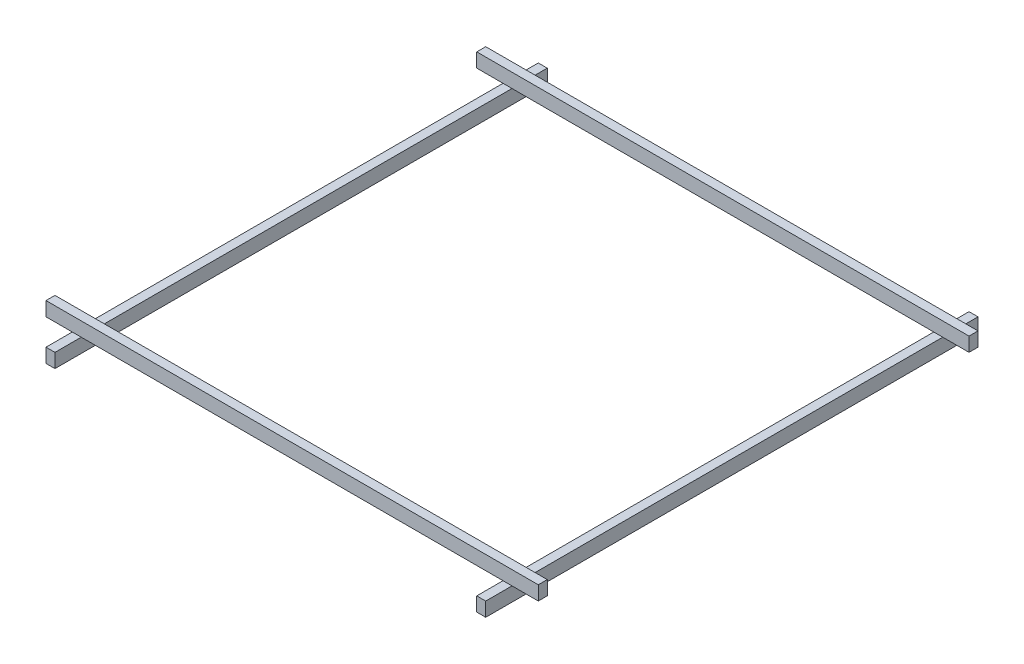
ISO-10303-21;
HEADER;
FILE_DESCRIPTION(('STEP AP214'),'2;1');
FILE_NAME('part.step','',(''),(''),'','','');
FILE_SCHEMA(('AUTOMOTIVE_DESIGN { 1 0 10303 214 1 1 1 1 }'));
ENDSEC;
DATA;
#1=APPLICATION_CONTEXT('core data for automotive mechanical design processes');
#2=APPLICATION_PROTOCOL_DEFINITION('international standard','automotive_design',2000,#1);
#3=PRODUCT_CONTEXT('',#1,'mechanical');
#4=PRODUCT('Part','Part','',(#3));
#5=PRODUCT_RELATED_PRODUCT_CATEGORY('part','',(#4));
#6=PRODUCT_DEFINITION_FORMATION('','',#4);
#7=PRODUCT_DEFINITION_CONTEXT('part definition',#1,'design');
#8=PRODUCT_DEFINITION('design','',#6,#7);
#9=PRODUCT_DEFINITION_SHAPE('','',#8);
#10=(LENGTH_UNIT() NAMED_UNIT(*) SI_UNIT(.MILLI.,.METRE.));
#11=(NAMED_UNIT(*) PLANE_ANGLE_UNIT() SI_UNIT($,.RADIAN.));
#12=(NAMED_UNIT(*) SI_UNIT($,.STERADIAN.) SOLID_ANGLE_UNIT());
#13=UNCERTAINTY_MEASURE_WITH_UNIT(LENGTH_MEASURE(1.E-05),#10,'distance_accuracy_value','');
#14=(GEOMETRIC_REPRESENTATION_CONTEXT(3) GLOBAL_UNCERTAINTY_ASSIGNED_CONTEXT((#13)) GLOBAL_UNIT_ASSIGNED_CONTEXT((#10,
#11,#12)) REPRESENTATION_CONTEXT('',''));
#15=CARTESIAN_POINT('',(0.,0.,0.));
#16=DIRECTION('',(0.,0.,1.));
#17=DIRECTION('',(1.,0.,0.));
#18=AXIS2_PLACEMENT_3D('',#15,#16,#17);
#19=CARTESIAN_POINT('',(4572.,209.55,-349.249999999999));
#20=DIRECTION('',(0.,0.,1.));
#21=DIRECTION('',(0.,-1.,0.));
#22=AXIS2_PLACEMENT_3D('',#19,#20,#21);
#23=PLANE('',#22);
#24=DIRECTION('',(0.,1.,0.));
#25=VECTOR('',#24,1.);
#26=CARTESIAN_POINT('',(-304.8,209.55,-349.249999999999));
#27=LINE('',#26,#25);
#28=CARTESIAN_POINT('',(-304.8,69.85,-349.249999999999));
#29=VERTEX_POINT('',#28);
#30=CARTESIAN_POINT('',(-304.8,209.55,-349.249999999999));
#31=VERTEX_POINT('',#30);
#32=EDGE_CURVE('E126',#29,#31,#27,.T.);
#33=ORIENTED_EDGE('',*,*,#32,.T.);
#34=DIRECTION('',(-1.,0.,0.));
#35=VECTOR('',#34,1.);
#36=CARTESIAN_POINT('',(4572.,209.55,-349.249999999999));
#37=LINE('',#36,#35);
#38=CARTESIAN_POINT('',(4572.,209.55,-349.249999999999));
#39=VERTEX_POINT('',#38);
#40=EDGE_CURVE('E13',#39,#31,#37,.T.);
#41=ORIENTED_EDGE('',*,*,#40,.F.);
#42=DIRECTION('',(0.,1.,0.));
#43=VECTOR('',#42,1.);
#44=CARTESIAN_POINT('',(4572.,209.55,-349.249999999999));
#45=LINE('',#44,#43);
#46=CARTESIAN_POINT('',(4572.,69.85,-349.249999999999));
#47=VERTEX_POINT('',#46);
#48=EDGE_CURVE('E114',#47,#39,#45,.T.);
#49=ORIENTED_EDGE('',*,*,#48,.F.);
#50=DIRECTION('',(-1.,0.,0.));
#51=VECTOR('',#50,1.);
#52=CARTESIAN_POINT('',(4572.,69.85,-349.249999999999));
#53=LINE('',#52,#51);
#54=EDGE_CURVE('E122',#47,#29,#53,.T.);
#55=ORIENTED_EDGE('',*,*,#54,.T.);
#56=EDGE_LOOP('',(#33,#41,#49,#55));
#57=FACE_BOUND('',#56,.T.);
#58=ADVANCED_FACE('F63',(#57),#23,.F.);
#59=CARTESIAN_POINT('',(4572.,209.55,-260.349999999999));
#60=DIRECTION('',(0.,-1.,0.));
#61=DIRECTION('',(0.,0.,-1.));
#62=AXIS2_PLACEMENT_3D('',#59,#60,#61);
#63=PLANE('',#62);
#64=DIRECTION('',(0.,0.,1.));
#65=VECTOR('',#64,1.);
#66=CARTESIAN_POINT('',(-304.8,209.55,-260.349999999999));
#67=LINE('',#66,#65);
#68=CARTESIAN_POINT('',(-304.8,209.55,-260.349999999999));
#69=VERTEX_POINT('',#68);
#70=EDGE_CURVE('E118',#31,#69,#67,.T.);
#71=ORIENTED_EDGE('',*,*,#70,.T.);
#72=DIRECTION('',(-1.,0.,0.));
#73=VECTOR('',#72,1.);
#74=CARTESIAN_POINT('',(4572.,209.55,-260.349999999999));
#75=LINE('',#74,#73);
#76=CARTESIAN_POINT('',(4572.,209.55,-260.349999999999));
#77=VERTEX_POINT('',#76);
#78=EDGE_CURVE('E71',#77,#69,#75,.T.);
#79=ORIENTED_EDGE('',*,*,#78,.F.);
#80=DIRECTION('',(0.,0.,1.));
#81=VECTOR('',#80,1.);
#82=CARTESIAN_POINT('',(4572.,209.55,-260.349999999999));
#83=LINE('',#82,#81);
#84=EDGE_CURVE('E109',#39,#77,#83,.T.);
#85=ORIENTED_EDGE('',*,*,#84,.F.);
#86=ORIENTED_EDGE('',*,*,#40,.T.);
#87=EDGE_LOOP('',(#71,#79,#85,#86));
#88=FACE_BOUND('',#87,.T.);
#89=ADVANCED_FACE('F117',(#88),#63,.F.);
#90=CARTESIAN_POINT('',(4572.,209.55,-260.349999999999));
#91=DIRECTION('',(0.,0.,-1.));
#92=DIRECTION('',(0.,1.,0.));
#93=AXIS2_PLACEMENT_3D('',#90,#91,#92);
#94=PLANE('',#93);
#95=DIRECTION('',(0.,-1.,0.));
#96=VECTOR('',#95,1.);
#97=CARTESIAN_POINT('',(-304.8,209.55,-260.349999999999));
#98=LINE('',#97,#96);
#99=CARTESIAN_POINT('',(-304.8,69.85,-260.349999999999));
#100=VERTEX_POINT('',#99);
#101=EDGE_CURVE('E96',#69,#100,#98,.T.);
#102=ORIENTED_EDGE('',*,*,#101,.T.);
#103=DIRECTION('',(-1.,0.,0.));
#104=VECTOR('',#103,1.);
#105=CARTESIAN_POINT('',(4572.,69.85,-260.349999999999));
#106=LINE('',#105,#104);
#107=CARTESIAN_POINT('',(4572.,69.85,-260.349999999999));
#108=VERTEX_POINT('',#107);
#109=EDGE_CURVE('E119',#108,#100,#106,.T.);
#110=ORIENTED_EDGE('',*,*,#109,.F.);
#111=DIRECTION('',(0.,-1.,0.));
#112=VECTOR('',#111,1.);
#113=CARTESIAN_POINT('',(4572.,209.55,-260.349999999999));
#114=LINE('',#113,#112);
#115=EDGE_CURVE('E112',#77,#108,#114,.T.);
#116=ORIENTED_EDGE('',*,*,#115,.F.);
#117=ORIENTED_EDGE('',*,*,#78,.T.);
#118=EDGE_LOOP('',(#102,#110,#116,#117));
#119=FACE_BOUND('',#118,.T.);
#120=ADVANCED_FACE('F120',(#119),#94,.F.);
#121=CARTESIAN_POINT('',(4572.,69.85,-260.349999999999));
#122=DIRECTION('',(0.,1.,0.));
#123=DIRECTION('',(0.,0.,1.));
#124=AXIS2_PLACEMENT_3D('',#121,#122,#123);
#125=PLANE('',#124);
#126=DIRECTION('',(0.,0.,-1.));
#127=VECTOR('',#126,1.);
#128=CARTESIAN_POINT('',(-304.8,69.85,-260.349999999999));
#129=LINE('',#128,#127);
#130=EDGE_CURVE('E102',#100,#29,#129,.T.);
#131=ORIENTED_EDGE('',*,*,#130,.T.);
#132=ORIENTED_EDGE('',*,*,#54,.F.);
#133=DIRECTION('',(0.,0.,-1.));
#134=VECTOR('',#133,1.);
#135=CARTESIAN_POINT('',(4572.,69.85,-260.349999999999));
#136=LINE('',#135,#134);
#137=EDGE_CURVE('E79',#108,#47,#136,.T.);
#138=ORIENTED_EDGE('',*,*,#137,.F.);
#139=ORIENTED_EDGE('',*,*,#109,.T.);
#140=EDGE_LOOP('',(#131,#132,#138,#139));
#141=FACE_BOUND('',#140,.T.);
#142=ADVANCED_FACE('F133',(#141),#125,.F.);
#143=CARTESIAN_POINT('',(4572.,139.7,-304.799999999999));
#144=DIRECTION('',(1.,0.,0.));
#145=DIRECTION('',(0.,0.,-1.));
#146=AXIS2_PLACEMENT_3D('',#143,#144,#145);
#147=PLANE('',#146);
#148=ORIENTED_EDGE('',*,*,#48,.T.);
#149=ORIENTED_EDGE('',*,*,#84,.T.);
#150=ORIENTED_EDGE('',*,*,#115,.T.);
#151=ORIENTED_EDGE('',*,*,#137,.T.);
#152=EDGE_LOOP('',(#148,#149,#150,#151));
#153=FACE_BOUND('',#152,.T.);
#154=ADVANCED_FACE('F110',(#153),#147,.T.);
#155=CARTESIAN_POINT('',(-304.8,139.7,-304.799999999999));
#156=DIRECTION('',(1.,0.,0.));
#157=DIRECTION('',(0.,0.,-1.));
#158=AXIS2_PLACEMENT_3D('',#155,#156,#157);
#159=PLANE('',#158);
#160=ORIENTED_EDGE('',*,*,#32,.F.);
#161=ORIENTED_EDGE('',*,*,#130,.F.);
#162=ORIENTED_EDGE('',*,*,#101,.F.);
#163=ORIENTED_EDGE('',*,*,#70,.F.);
#164=EDGE_LOOP('',(#160,#161,#162,#163));
#165=FACE_BOUND('',#164,.T.);
#166=ADVANCED_FACE('F136',(#165),#159,.F.);
#167=CLOSED_SHELL('',(#58,#89,#120,#142,#154,#166));
#168=MANIFOLD_SOLID_BREP('B2',#167);
#169=CARTESIAN_POINT('',(4572.,209.55,-4616.45));
#170=DIRECTION('',(0.,0.,1.));
#171=DIRECTION('',(0.,-1.,0.));
#172=AXIS2_PLACEMENT_3D('',#169,#170,#171);
#173=PLANE('',#172);
#174=DIRECTION('',(0.,1.,0.));
#175=VECTOR('',#174,1.);
#176=CARTESIAN_POINT('',(-304.8,209.55,-4616.45));
#177=LINE('',#176,#175);
#178=CARTESIAN_POINT('',(-304.8,69.85,-4616.45));
#179=VERTEX_POINT('',#178);
#180=CARTESIAN_POINT('',(-304.8,209.55,-4616.45));
#181=VERTEX_POINT('',#180);
#182=EDGE_CURVE('E283',#179,#181,#177,.T.);
#183=ORIENTED_EDGE('',*,*,#182,.T.);
#184=DIRECTION('',(-1.,0.,0.));
#185=VECTOR('',#184,1.);
#186=CARTESIAN_POINT('',(4572.,209.55,-4616.45));
#187=LINE('',#186,#185);
#188=CARTESIAN_POINT('',(4572.,209.55,-4616.45));
#189=VERTEX_POINT('',#188);
#190=EDGE_CURVE('E61',#189,#181,#187,.T.);
#191=ORIENTED_EDGE('',*,*,#190,.F.);
#192=DIRECTION('',(0.,1.,0.));
#193=VECTOR('',#192,1.);
#194=CARTESIAN_POINT('',(4572.,209.55,-4616.45));
#195=LINE('',#194,#193);
#196=CARTESIAN_POINT('',(4572.,69.85,-4616.45));
#197=VERTEX_POINT('',#196);
#198=EDGE_CURVE('E271',#197,#189,#195,.T.);
#199=ORIENTED_EDGE('',*,*,#198,.F.);
#200=DIRECTION('',(-1.,0.,0.));
#201=VECTOR('',#200,1.);
#202=CARTESIAN_POINT('',(4572.,69.85,-4616.45));
#203=LINE('',#202,#201);
#204=EDGE_CURVE('E279',#197,#179,#203,.T.);
#205=ORIENTED_EDGE('',*,*,#204,.T.);
#206=EDGE_LOOP('',(#183,#191,#199,#205));
#207=FACE_BOUND('',#206,.T.);
#208=ADVANCED_FACE('F220',(#207),#173,.F.);
#209=CARTESIAN_POINT('',(4572.,209.55,-4527.55));
#210=DIRECTION('',(0.,-1.,0.));
#211=DIRECTION('',(0.,0.,-1.));
#212=AXIS2_PLACEMENT_3D('',#209,#210,#211);
#213=PLANE('',#212);
#214=DIRECTION('',(0.,0.,1.));
#215=VECTOR('',#214,1.);
#216=CARTESIAN_POINT('',(-304.8,209.55,-4527.55));
#217=LINE('',#216,#215);
#218=CARTESIAN_POINT('',(-304.8,209.55,-4527.55));
#219=VERTEX_POINT('',#218);
#220=EDGE_CURVE('E275',#181,#219,#217,.T.);
#221=ORIENTED_EDGE('',*,*,#220,.T.);
#222=DIRECTION('',(-1.,0.,0.));
#223=VECTOR('',#222,1.);
#224=CARTESIAN_POINT('',(4572.,209.55,-4527.55));
#225=LINE('',#224,#223);
#226=CARTESIAN_POINT('',(4572.,209.55,-4527.55));
#227=VERTEX_POINT('',#226);
#228=EDGE_CURVE('E228',#227,#219,#225,.T.);
#229=ORIENTED_EDGE('',*,*,#228,.F.);
#230=DIRECTION('',(0.,0.,1.));
#231=VECTOR('',#230,1.);
#232=CARTESIAN_POINT('',(4572.,209.55,-4527.55));
#233=LINE('',#232,#231);
#234=EDGE_CURVE('E266',#189,#227,#233,.T.);
#235=ORIENTED_EDGE('',*,*,#234,.F.);
#236=ORIENTED_EDGE('',*,*,#190,.T.);
#237=EDGE_LOOP('',(#221,#229,#235,#236));
#238=FACE_BOUND('',#237,.T.);
#239=ADVANCED_FACE('F274',(#238),#213,.F.);
#240=CARTESIAN_POINT('',(4572.,209.55,-4527.55));
#241=DIRECTION('',(0.,0.,-1.));
#242=DIRECTION('',(0.,1.,0.));
#243=AXIS2_PLACEMENT_3D('',#240,#241,#242);
#244=PLANE('',#243);
#245=DIRECTION('',(0.,-1.,0.));
#246=VECTOR('',#245,1.);
#247=CARTESIAN_POINT('',(-304.8,209.55,-4527.55));
#248=LINE('',#247,#246);
#249=CARTESIAN_POINT('',(-304.8,69.85,-4527.55));
#250=VERTEX_POINT('',#249);
#251=EDGE_CURVE('E253',#219,#250,#248,.T.);
#252=ORIENTED_EDGE('',*,*,#251,.T.);
#253=DIRECTION('',(-1.,0.,0.));
#254=VECTOR('',#253,1.);
#255=CARTESIAN_POINT('',(4572.,69.85,-4527.55));
#256=LINE('',#255,#254);
#257=CARTESIAN_POINT('',(4572.,69.85,-4527.55));
#258=VERTEX_POINT('',#257);
#259=EDGE_CURVE('E276',#258,#250,#256,.T.);
#260=ORIENTED_EDGE('',*,*,#259,.F.);
#261=DIRECTION('',(0.,-1.,0.));
#262=VECTOR('',#261,1.);
#263=CARTESIAN_POINT('',(4572.,209.55,-4527.55));
#264=LINE('',#263,#262);
#265=EDGE_CURVE('E269',#227,#258,#264,.T.);
#266=ORIENTED_EDGE('',*,*,#265,.F.);
#267=ORIENTED_EDGE('',*,*,#228,.T.);
#268=EDGE_LOOP('',(#252,#260,#266,#267));
#269=FACE_BOUND('',#268,.T.);
#270=ADVANCED_FACE('F277',(#269),#244,.F.);
#271=CARTESIAN_POINT('',(4572.,69.85,-4527.55));
#272=DIRECTION('',(0.,1.,0.));
#273=DIRECTION('',(0.,0.,1.));
#274=AXIS2_PLACEMENT_3D('',#271,#272,#273);
#275=PLANE('',#274);
#276=DIRECTION('',(0.,0.,-1.));
#277=VECTOR('',#276,1.);
#278=CARTESIAN_POINT('',(-304.8,69.85,-4527.55));
#279=LINE('',#278,#277);
#280=EDGE_CURVE('E259',#250,#179,#279,.T.);
#281=ORIENTED_EDGE('',*,*,#280,.T.);
#282=ORIENTED_EDGE('',*,*,#204,.F.);
#283=DIRECTION('',(0.,0.,-1.));
#284=VECTOR('',#283,1.);
#285=CARTESIAN_POINT('',(4572.,69.85,-4527.55));
#286=LINE('',#285,#284);
#287=EDGE_CURVE('E236',#258,#197,#286,.T.);
#288=ORIENTED_EDGE('',*,*,#287,.F.);
#289=ORIENTED_EDGE('',*,*,#259,.T.);
#290=EDGE_LOOP('',(#281,#282,#288,#289));
#291=FACE_BOUND('',#290,.T.);
#292=ADVANCED_FACE('F290',(#291),#275,.F.);
#293=CARTESIAN_POINT('',(4572.,139.7,-4572.));
#294=DIRECTION('',(1.,0.,0.));
#295=DIRECTION('',(0.,0.,-1.));
#296=AXIS2_PLACEMENT_3D('',#293,#294,#295);
#297=PLANE('',#296);
#298=ORIENTED_EDGE('',*,*,#198,.T.);
#299=ORIENTED_EDGE('',*,*,#234,.T.);
#300=ORIENTED_EDGE('',*,*,#265,.T.);
#301=ORIENTED_EDGE('',*,*,#287,.T.);
#302=EDGE_LOOP('',(#298,#299,#300,#301));
#303=FACE_BOUND('',#302,.T.);
#304=ADVANCED_FACE('F267',(#303),#297,.T.);
#305=CARTESIAN_POINT('',(-304.8,139.7,-4572.));
#306=DIRECTION('',(1.,0.,0.));
#307=DIRECTION('',(0.,0.,-1.));
#308=AXIS2_PLACEMENT_3D('',#305,#306,#307);
#309=PLANE('',#308);
#310=ORIENTED_EDGE('',*,*,#182,.F.);
#311=ORIENTED_EDGE('',*,*,#280,.F.);
#312=ORIENTED_EDGE('',*,*,#251,.F.);
#313=ORIENTED_EDGE('',*,*,#220,.F.);
#314=EDGE_LOOP('',(#310,#311,#312,#313));
#315=FACE_BOUND('',#314,.T.);
#316=ADVANCED_FACE('F293',(#315),#309,.F.);
#317=CLOSED_SHELL('',(#208,#239,#270,#292,#304,#316));
#318=MANIFOLD_SOLID_BREP('B7',#317);
#319=CARTESIAN_POINT('',(4222.75,69.85,-4876.8));
#320=DIRECTION('',(1.,0.,0.));
#321=DIRECTION('',(0.,1.,0.));
#322=AXIS2_PLACEMENT_3D('',#319,#320,#321);
#323=PLANE('',#322);
#324=DIRECTION('',(0.,1.,0.));
#325=VECTOR('',#324,1.);
#326=CARTESIAN_POINT('',(4222.75,69.85,-8.88178419700126E-13));
#327=LINE('',#326,#325);
#328=CARTESIAN_POINT('',(4222.75,-69.85,-8.88178419700126E-13));
#329=VERTEX_POINT('',#328);
#330=CARTESIAN_POINT('',(4222.75,69.85,-8.88178419700126E-13));
#331=VERTEX_POINT('',#330);
#332=EDGE_CURVE('E439',#329,#331,#327,.T.);
#333=ORIENTED_EDGE('',*,*,#332,.T.);
#334=DIRECTION('',(0.,0.,1.));
#335=VECTOR('',#334,1.);
#336=CARTESIAN_POINT('',(4222.75,69.85,-4876.8));
#337=LINE('',#336,#335);
#338=CARTESIAN_POINT('',(4222.75,69.85,-4876.8));
#339=VERTEX_POINT('',#338);
#340=EDGE_CURVE('E218',#339,#331,#337,.T.);
#341=ORIENTED_EDGE('',*,*,#340,.F.);
#342=DIRECTION('',(0.,1.,0.));
#343=VECTOR('',#342,1.);
#344=CARTESIAN_POINT('',(4222.75,69.85,-4876.8));
#345=LINE('',#344,#343);
#346=CARTESIAN_POINT('',(4222.75,-69.85,-4876.8));
#347=VERTEX_POINT('',#346);
#348=EDGE_CURVE('E427',#347,#339,#345,.T.);
#349=ORIENTED_EDGE('',*,*,#348,.F.);
#350=DIRECTION('',(0.,0.,1.));
#351=VECTOR('',#350,1.);
#352=CARTESIAN_POINT('',(4222.75,-69.85,-4876.8));
#353=LINE('',#352,#351);
#354=EDGE_CURVE('E435',#347,#329,#353,.T.);
#355=ORIENTED_EDGE('',*,*,#354,.T.);
#356=EDGE_LOOP('',(#333,#341,#349,#355));
#357=FACE_BOUND('',#356,.T.);
#358=ADVANCED_FACE('F376',(#357),#323,.F.);
#359=CARTESIAN_POINT('',(4311.65,69.85,-4876.8));
#360=DIRECTION('',(0.,-1.,0.));
#361=DIRECTION('',(0.,0.,-1.));
#362=AXIS2_PLACEMENT_3D('',#359,#360,#361);
#363=PLANE('',#362);
#364=DIRECTION('',(1.,0.,0.));
#365=VECTOR('',#364,1.);
#366=CARTESIAN_POINT('',(4311.65,69.85,-8.88178419700126E-13));
#367=LINE('',#366,#365);
#368=CARTESIAN_POINT('',(4311.65,69.85,-8.88178419700126E-13));
#369=VERTEX_POINT('',#368);
#370=EDGE_CURVE('E431',#331,#369,#367,.T.);
#371=ORIENTED_EDGE('',*,*,#370,.T.);
#372=DIRECTION('',(0.,0.,1.));
#373=VECTOR('',#372,1.);
#374=CARTESIAN_POINT('',(4311.65,69.85,-4876.8));
#375=LINE('',#374,#373);
#376=CARTESIAN_POINT('',(4311.65,69.85,-4876.8));
#377=VERTEX_POINT('',#376);
#378=EDGE_CURVE('E384',#377,#369,#375,.T.);
#379=ORIENTED_EDGE('',*,*,#378,.F.);
#380=DIRECTION('',(1.,0.,0.));
#381=VECTOR('',#380,1.);
#382=CARTESIAN_POINT('',(4311.65,69.85,-4876.8));
#383=LINE('',#382,#381);
#384=EDGE_CURVE('E422',#339,#377,#383,.T.);
#385=ORIENTED_EDGE('',*,*,#384,.F.);
#386=ORIENTED_EDGE('',*,*,#340,.T.);
#387=EDGE_LOOP('',(#371,#379,#385,#386));
#388=FACE_BOUND('',#387,.T.);
#389=ADVANCED_FACE('F430',(#388),#363,.F.);
#390=CARTESIAN_POINT('',(4311.65,69.85,-4876.8));
#391=DIRECTION('',(-1.,0.,0.));
#392=DIRECTION('',(0.,-1.,0.));
#393=AXIS2_PLACEMENT_3D('',#390,#391,#392);
#394=PLANE('',#393);
#395=DIRECTION('',(0.,-1.,0.));
#396=VECTOR('',#395,1.);
#397=CARTESIAN_POINT('',(4311.65,69.85,-8.88178419700126E-13));
#398=LINE('',#397,#396);
#399=CARTESIAN_POINT('',(4311.65,-69.85,-8.88178419700126E-13));
#400=VERTEX_POINT('',#399);
#401=EDGE_CURVE('E409',#369,#400,#398,.T.);
#402=ORIENTED_EDGE('',*,*,#401,.T.);
#403=DIRECTION('',(0.,0.,1.));
#404=VECTOR('',#403,1.);
#405=CARTESIAN_POINT('',(4311.65,-69.85,-4876.8));
#406=LINE('',#405,#404);
#407=CARTESIAN_POINT('',(4311.65,-69.85,-4876.8));
#408=VERTEX_POINT('',#407);
#409=EDGE_CURVE('E432',#408,#400,#406,.T.);
#410=ORIENTED_EDGE('',*,*,#409,.F.);
#411=DIRECTION('',(0.,-1.,0.));
#412=VECTOR('',#411,1.);
#413=CARTESIAN_POINT('',(4311.65,69.85,-4876.8));
#414=LINE('',#413,#412);
#415=EDGE_CURVE('E425',#377,#408,#414,.T.);
#416=ORIENTED_EDGE('',*,*,#415,.F.);
#417=ORIENTED_EDGE('',*,*,#378,.T.);
#418=EDGE_LOOP('',(#402,#410,#416,#417));
#419=FACE_BOUND('',#418,.T.);
#420=ADVANCED_FACE('F433',(#419),#394,.F.);
#421=CARTESIAN_POINT('',(4311.65,-69.85,-4876.8));
#422=DIRECTION('',(0.,1.,0.));
#423=DIRECTION('',(0.,0.,1.));
#424=AXIS2_PLACEMENT_3D('',#421,#422,#423);
#425=PLANE('',#424);
#426=DIRECTION('',(-1.,0.,0.));
#427=VECTOR('',#426,1.);
#428=CARTESIAN_POINT('',(4311.65,-69.85,-8.88178419700126E-13));
#429=LINE('',#428,#427);
#430=EDGE_CURVE('E415',#400,#329,#429,.T.);
#431=ORIENTED_EDGE('',*,*,#430,.T.);
#432=ORIENTED_EDGE('',*,*,#354,.F.);
#433=DIRECTION('',(-1.,0.,0.));
#434=VECTOR('',#433,1.);
#435=CARTESIAN_POINT('',(4311.65,-69.85,-4876.8));
#436=LINE('',#435,#434);
#437=EDGE_CURVE('E392',#408,#347,#436,.T.);
#438=ORIENTED_EDGE('',*,*,#437,.F.);
#439=ORIENTED_EDGE('',*,*,#409,.T.);
#440=EDGE_LOOP('',(#431,#432,#438,#439));
#441=FACE_BOUND('',#440,.T.);
#442=ADVANCED_FACE('F446',(#441),#425,.F.);
#443=CARTESIAN_POINT('',(4267.2,0.,-4876.8));
#444=DIRECTION('',(0.,0.,-1.));
#445=DIRECTION('',(-1.,0.,0.));
#446=AXIS2_PLACEMENT_3D('',#443,#444,#445);
#447=PLANE('',#446);
#448=ORIENTED_EDGE('',*,*,#348,.T.);
#449=ORIENTED_EDGE('',*,*,#384,.T.);
#450=ORIENTED_EDGE('',*,*,#415,.T.);
#451=ORIENTED_EDGE('',*,*,#437,.T.);
#452=EDGE_LOOP('',(#448,#449,#450,#451));
#453=FACE_BOUND('',#452,.T.);
#454=ADVANCED_FACE('F423',(#453),#447,.T.);
#455=CARTESIAN_POINT('',(4267.2,0.,-8.88178419700126E-13));
#456=DIRECTION('',(0.,0.,-1.));
#457=DIRECTION('',(-1.,0.,0.));
#458=AXIS2_PLACEMENT_3D('',#455,#456,#457);
#459=PLANE('',#458);
#460=ORIENTED_EDGE('',*,*,#332,.F.);
#461=ORIENTED_EDGE('',*,*,#430,.F.);
#462=ORIENTED_EDGE('',*,*,#401,.F.);
#463=ORIENTED_EDGE('',*,*,#370,.F.);
#464=EDGE_LOOP('',(#460,#461,#462,#463));
#465=FACE_BOUND('',#464,.T.);
#466=ADVANCED_FACE('F449',(#465),#459,.F.);
#467=CLOSED_SHELL('',(#358,#389,#420,#442,#454,#466));
#468=MANIFOLD_SOLID_BREP('B55',#467);
#469=CARTESIAN_POINT('',(-44.45,69.85,-4876.8));
#470=DIRECTION('',(1.,0.,0.));
#471=DIRECTION('',(0.,1.,0.));
#472=AXIS2_PLACEMENT_3D('',#469,#470,#471);
#473=PLANE('',#472);
#474=DIRECTION('',(0.,1.,0.));
#475=VECTOR('',#474,1.);
#476=CARTESIAN_POINT('',(-44.45,69.85,0.));
#477=LINE('',#476,#475);
#478=CARTESIAN_POINT('',(-44.45,-69.85,0.));
#479=VERTEX_POINT('',#478);
#480=CARTESIAN_POINT('',(-44.45,69.85,0.));
#481=VERTEX_POINT('',#480);
#482=EDGE_CURVE('E586',#479,#481,#477,.T.);
#483=ORIENTED_EDGE('',*,*,#482,.T.);
#484=DIRECTION('',(0.,0.,1.));
#485=VECTOR('',#484,1.);
#486=CARTESIAN_POINT('',(-44.45,69.85,-4876.8));
#487=LINE('',#486,#485);
#488=CARTESIAN_POINT('',(-44.45,69.85,-4876.8));
#489=VERTEX_POINT('',#488);
#490=EDGE_CURVE('E374',#489,#481,#487,.T.);
#491=ORIENTED_EDGE('',*,*,#490,.F.);
#492=DIRECTION('',(0.,1.,0.));
#493=VECTOR('',#492,1.);
#494=CARTESIAN_POINT('',(-44.45,69.85,-4876.8));
#495=LINE('',#494,#493);
#496=CARTESIAN_POINT('',(-44.45,-69.85,-4876.8));
#497=VERTEX_POINT('',#496);
#498=EDGE_CURVE('E574',#497,#489,#495,.T.);
#499=ORIENTED_EDGE('',*,*,#498,.F.);
#500=DIRECTION('',(0.,0.,1.));
#501=VECTOR('',#500,1.);
#502=CARTESIAN_POINT('',(-44.45,-69.85,-4876.8));
#503=LINE('',#502,#501);
#504=EDGE_CURVE('E582',#497,#479,#503,.T.);
#505=ORIENTED_EDGE('',*,*,#504,.T.);
#506=EDGE_LOOP('',(#483,#491,#499,#505));
#507=FACE_BOUND('',#506,.T.);
#508=ADVANCED_FACE('F523',(#507),#473,.F.);
#509=CARTESIAN_POINT('',(44.45,69.85,-4876.8));
#510=DIRECTION('',(0.,-1.,0.));
#511=DIRECTION('',(0.,0.,-1.));
#512=AXIS2_PLACEMENT_3D('',#509,#510,#511);
#513=PLANE('',#512);
#514=DIRECTION('',(1.,0.,0.));
#515=VECTOR('',#514,1.);
#516=CARTESIAN_POINT('',(44.45,69.85,0.));
#517=LINE('',#516,#515);
#518=CARTESIAN_POINT('',(44.45,69.85,0.));
#519=VERTEX_POINT('',#518);
#520=EDGE_CURVE('E578',#481,#519,#517,.T.);
#521=ORIENTED_EDGE('',*,*,#520,.T.);
#522=DIRECTION('',(0.,0.,1.));
#523=VECTOR('',#522,1.);
#524=CARTESIAN_POINT('',(44.45,69.85,-4876.8));
#525=LINE('',#524,#523);
#526=CARTESIAN_POINT('',(44.45,69.85,-4876.8));
#527=VERTEX_POINT('',#526);
#528=EDGE_CURVE('E531',#527,#519,#525,.T.);
#529=ORIENTED_EDGE('',*,*,#528,.F.);
#530=DIRECTION('',(1.,0.,0.));
#531=VECTOR('',#530,1.);
#532=CARTESIAN_POINT('',(44.45,69.85,-4876.8));
#533=LINE('',#532,#531);
#534=EDGE_CURVE('E569',#489,#527,#533,.T.);
#535=ORIENTED_EDGE('',*,*,#534,.F.);
#536=ORIENTED_EDGE('',*,*,#490,.T.);
#537=EDGE_LOOP('',(#521,#529,#535,#536));
#538=FACE_BOUND('',#537,.T.);
#539=ADVANCED_FACE('F577',(#538),#513,.F.);
#540=CARTESIAN_POINT('',(44.45,69.85,-4876.8));
#541=DIRECTION('',(-1.,0.,0.));
#542=DIRECTION('',(0.,-1.,0.));
#543=AXIS2_PLACEMENT_3D('',#540,#541,#542);
#544=PLANE('',#543);
#545=DIRECTION('',(0.,-1.,0.));
#546=VECTOR('',#545,1.);
#547=CARTESIAN_POINT('',(44.45,69.85,0.));
#548=LINE('',#547,#546);
#549=CARTESIAN_POINT('',(44.45,-69.85,0.));
#550=VERTEX_POINT('',#549);
#551=EDGE_CURVE('E556',#519,#550,#548,.T.);
#552=ORIENTED_EDGE('',*,*,#551,.T.);
#553=DIRECTION('',(0.,0.,1.));
#554=VECTOR('',#553,1.);
#555=CARTESIAN_POINT('',(44.45,-69.85,-4876.8));
#556=LINE('',#555,#554);
#557=CARTESIAN_POINT('',(44.45,-69.85,-4876.8));
#558=VERTEX_POINT('',#557);
#559=EDGE_CURVE('E579',#558,#550,#556,.T.);
#560=ORIENTED_EDGE('',*,*,#559,.F.);
#561=DIRECTION('',(0.,-1.,0.));
#562=VECTOR('',#561,1.);
#563=CARTESIAN_POINT('',(44.45,69.85,-4876.8));
#564=LINE('',#563,#562);
#565=EDGE_CURVE('E572',#527,#558,#564,.T.);
#566=ORIENTED_EDGE('',*,*,#565,.F.);
#567=ORIENTED_EDGE('',*,*,#528,.T.);
#568=EDGE_LOOP('',(#552,#560,#566,#567));
#569=FACE_BOUND('',#568,.T.);
#570=ADVANCED_FACE('F580',(#569),#544,.F.);
#571=CARTESIAN_POINT('',(44.45,-69.85,-4876.8));
#572=DIRECTION('',(0.,1.,0.));
#573=DIRECTION('',(0.,0.,1.));
#574=AXIS2_PLACEMENT_3D('',#571,#572,#573);
#575=PLANE('',#574);
#576=DIRECTION('',(-1.,0.,0.));
#577=VECTOR('',#576,1.);
#578=CARTESIAN_POINT('',(44.45,-69.85,0.));
#579=LINE('',#578,#577);
#580=EDGE_CURVE('E562',#550,#479,#579,.T.);
#581=ORIENTED_EDGE('',*,*,#580,.T.);
#582=ORIENTED_EDGE('',*,*,#504,.F.);
#583=DIRECTION('',(-1.,0.,0.));
#584=VECTOR('',#583,1.);
#585=CARTESIAN_POINT('',(44.45,-69.85,-4876.8));
#586=LINE('',#585,#584);
#587=EDGE_CURVE('E539',#558,#497,#586,.T.);
#588=ORIENTED_EDGE('',*,*,#587,.F.);
#589=ORIENTED_EDGE('',*,*,#559,.T.);
#590=EDGE_LOOP('',(#581,#582,#588,#589));
#591=FACE_BOUND('',#590,.T.);
#592=ADVANCED_FACE('F593',(#591),#575,.F.);
#593=CARTESIAN_POINT('',(0.,0.,-4876.8));
#594=DIRECTION('',(0.,0.,-1.));
#595=DIRECTION('',(-1.,0.,0.));
#596=AXIS2_PLACEMENT_3D('',#593,#594,#595);
#597=PLANE('',#596);
#598=ORIENTED_EDGE('',*,*,#498,.T.);
#599=ORIENTED_EDGE('',*,*,#534,.T.);
#600=ORIENTED_EDGE('',*,*,#565,.T.);
#601=ORIENTED_EDGE('',*,*,#587,.T.);
#602=EDGE_LOOP('',(#598,#599,#600,#601));
#603=FACE_BOUND('',#602,.T.);
#604=ADVANCED_FACE('F570',(#603),#597,.T.);
#605=CARTESIAN_POINT('',(0.,0.,0.));
#606=DIRECTION('',(0.,0.,-1.));
#607=DIRECTION('',(-1.,0.,0.));
#608=AXIS2_PLACEMENT_3D('',#605,#606,#607);
#609=PLANE('',#608);
#610=ORIENTED_EDGE('',*,*,#482,.F.);
#611=ORIENTED_EDGE('',*,*,#580,.F.);
#612=ORIENTED_EDGE('',*,*,#551,.F.);
#613=ORIENTED_EDGE('',*,*,#520,.F.);
#614=EDGE_LOOP('',(#610,#611,#612,#613));
#615=FACE_BOUND('',#614,.T.);
#616=ADVANCED_FACE('F596',(#615),#609,.F.);
#617=CLOSED_SHELL('',(#508,#539,#570,#592,#604,#616));
#618=MANIFOLD_SOLID_BREP('B212',#617);
#619=ADVANCED_BREP_SHAPE_REPRESENTATION('',(#18,#168,#318,#468,#618),#14);
#620=SHAPE_DEFINITION_REPRESENTATION(#9,#619);
ENDSEC;
END-ISO-10303-21;
